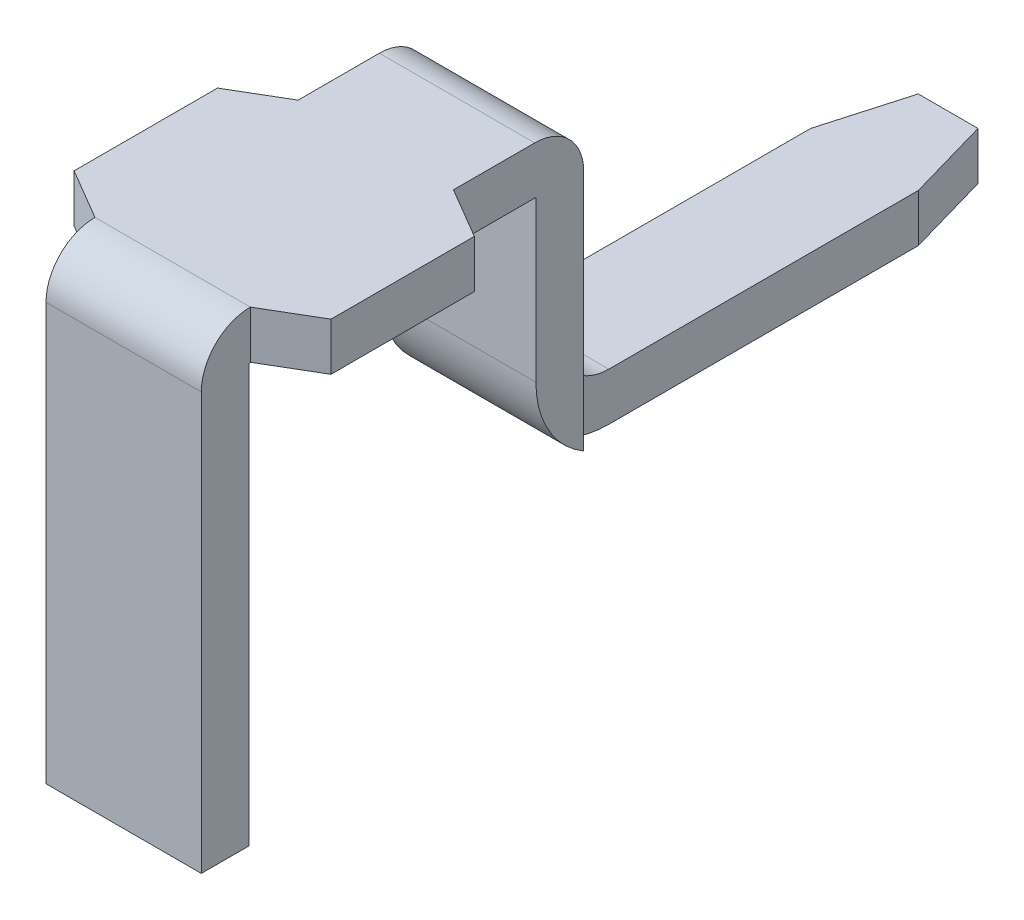
ISO-10303-21;
HEADER;
FILE_DESCRIPTION(('STEP AP214'),'2;1');
FILE_NAME('part.step','',(''),(''),'','','');
FILE_SCHEMA(('AUTOMOTIVE_DESIGN { 1 0 10303 214 1 1 1 1 }'));
ENDSEC;
DATA;
#1=APPLICATION_CONTEXT('core data for automotive mechanical design processes');
#2=APPLICATION_PROTOCOL_DEFINITION('international standard','automotive_design',2000,#1);
#3=PRODUCT_CONTEXT('',#1,'mechanical');
#4=PRODUCT('Part','Part','',(#3));
#5=PRODUCT_RELATED_PRODUCT_CATEGORY('part','',(#4));
#6=PRODUCT_DEFINITION_FORMATION('','',#4);
#7=PRODUCT_DEFINITION_CONTEXT('part definition',#1,'design');
#8=PRODUCT_DEFINITION('design','',#6,#7);
#9=PRODUCT_DEFINITION_SHAPE('','',#8);
#10=(LENGTH_UNIT() NAMED_UNIT(*) SI_UNIT(.MILLI.,.METRE.));
#11=(NAMED_UNIT(*) PLANE_ANGLE_UNIT() SI_UNIT($,.RADIAN.));
#12=(NAMED_UNIT(*) SI_UNIT($,.STERADIAN.) SOLID_ANGLE_UNIT());
#13=UNCERTAINTY_MEASURE_WITH_UNIT(LENGTH_MEASURE(1.E-05),#10,'distance_accuracy_value','');
#14=(GEOMETRIC_REPRESENTATION_CONTEXT(3) GLOBAL_UNCERTAINTY_ASSIGNED_CONTEXT((#13)) GLOBAL_UNIT_ASSIGNED_CONTEXT((#10,
#11,#12)) REPRESENTATION_CONTEXT('',''));
#15=CARTESIAN_POINT('',(0.,0.,0.));
#16=DIRECTION('',(0.,0.,1.));
#17=DIRECTION('',(1.,0.,0.));
#18=AXIS2_PLACEMENT_3D('',#15,#16,#17);
#19=CARTESIAN_POINT('',(3.615,0.2,-5.95));
#20=DIRECTION('',(0.,0.,1.));
#21=DIRECTION('',(1.,0.,0.));
#22=AXIS2_PLACEMENT_3D('',#19,#20,#21);
#23=PLANE('',#22);
#24=DIRECTION('',(0.,1.,0.));
#25=VECTOR('',#24,1.);
#26=CARTESIAN_POINT('',(2.79000000000029,-5.862338278469,-5.95000000000008));
#27=LINE('',#26,#25);
#28=CARTESIAN_POINT('',(2.79000000000009,0.2,-5.95000000000003));
#29=VERTEX_POINT('',#28);
#30=CARTESIAN_POINT('',(2.79000000000009,-0.2,-5.95000000000003));
#31=VERTEX_POINT('',#30);
#32=EDGE_CURVE('E200',#29,#31,#27,.F.);
#33=ORIENTED_EDGE('',*,*,#32,.T.);
#34=DIRECTION('',(1.,0.,0.));
#35=VECTOR('',#34,1.);
#36=CARTESIAN_POINT('',(3.615,-0.2,-5.95));
#37=LINE('',#36,#35);
#38=CARTESIAN_POINT('',(2.29,-0.2,-5.95));
#39=VERTEX_POINT('',#38);
#40=EDGE_CURVE('E216',#39,#31,#37,.T.);
#41=ORIENTED_EDGE('',*,*,#40,.F.);
#42=DIRECTION('',(0.,1.,0.));
#43=VECTOR('',#42,1.);
#44=CARTESIAN_POINT('',(2.29,0.2,-5.95));
#45=LINE('',#44,#43);
#46=CARTESIAN_POINT('',(2.29,0.199999999999999,-5.95));
#47=VERTEX_POINT('',#46);
#48=EDGE_CURVE('E209',#39,#47,#45,.T.);
#49=ORIENTED_EDGE('',*,*,#48,.T.);
#50=DIRECTION('',(1.,0.,0.));
#51=VECTOR('',#50,1.);
#52=CARTESIAN_POINT('',(3.615,0.2,-5.95));
#53=LINE('',#52,#51);
#54=EDGE_CURVE('E287',#47,#29,#53,.T.);
#55=ORIENTED_EDGE('',*,*,#54,.T.);
#56=EDGE_LOOP('',(#33,#41,#49,#55));
#57=FACE_BOUND('',#56,.T.);
#58=ADVANCED_FACE('F17',(#57),#23,.F.);
#59=CARTESIAN_POINT('',(2.99,-5.862338278469,-5.25));
#60=DIRECTION('',(-0.961523947640936,0.,0.274721127896982));
#61=DIRECTION('',(0.274721127896982,0.,0.961523947640936));
#62=AXIS2_PLACEMENT_3D('',#59,#60,#61);
#63=PLANE('',#62);
#64=ORIENTED_EDGE('',*,*,#32,.F.);
#65=DIRECTION('',(0.274721127897379,0.,0.961523947640823));
#66=VECTOR('',#65,1.);
#67=CARTESIAN_POINT('',(2.79,0.199999999999999,-5.95));
#68=LINE('',#67,#66);
#69=CARTESIAN_POINT('',(2.99,0.199999999999999,-5.25));
#70=VERTEX_POINT('',#69);
#71=EDGE_CURVE('E281',#29,#70,#68,.T.);
#72=ORIENTED_EDGE('',*,*,#71,.T.);
#73=DIRECTION('',(0.,1.,0.));
#74=VECTOR('',#73,1.);
#75=CARTESIAN_POINT('',(2.99,-5.862338278469,-5.25));
#76=LINE('',#75,#74);
#77=CARTESIAN_POINT('',(2.99,-0.2,-5.25));
#78=VERTEX_POINT('',#77);
#79=EDGE_CURVE('E266',#70,#78,#76,.F.);
#80=ORIENTED_EDGE('',*,*,#79,.T.);
#81=DIRECTION('',(0.274721127897379,0.,0.961523947640823));
#82=VECTOR('',#81,1.);
#83=CARTESIAN_POINT('',(2.79,-0.200000000000001,-5.95));
#84=LINE('',#83,#82);
#85=EDGE_CURVE('E214',#31,#78,#84,.T.);
#86=ORIENTED_EDGE('',*,*,#85,.F.);
#87=EDGE_LOOP('',(#64,#72,#80,#86));
#88=FACE_BOUND('',#87,.T.);
#89=ADVANCED_FACE('F309',(#88),#63,.F.);
#90=CARTESIAN_POINT('',(2.99,-5.862338278469,-5.95));
#91=DIRECTION('',(-1.,0.,0.));
#92=DIRECTION('',(0.,0.,1.));
#93=AXIS2_PLACEMENT_3D('',#90,#91,#92);
#94=PLANE('',#93);
#95=ORIENTED_EDGE('',*,*,#79,.F.);
#96=DIRECTION('',(0.,0.,1.));
#97=VECTOR('',#96,1.);
#98=CARTESIAN_POINT('',(2.99,0.2,-5.95));
#99=LINE('',#98,#97);
#100=CARTESIAN_POINT('',(2.99,0.199999999999998,-2.66));
#101=VERTEX_POINT('',#100);
#102=EDGE_CURVE('E278',#70,#101,#99,.T.);
#103=ORIENTED_EDGE('',*,*,#102,.T.);
#104=CARTESIAN_POINT('',(2.99,0.61,-2.66));
#105=DIRECTION('',(-1.,0.,0.));
#106=DIRECTION('',(0.,0.,1.));
#107=AXIS2_PLACEMENT_3D('',#104,#105,#106);
#108=CIRCLE('',#107,0.41);
#109=CARTESIAN_POINT('',(2.99,0.61,-2.25));
#110=VERTEX_POINT('',#109);
#111=EDGE_CURVE('E265',#110,#101,#108,.F.);
#112=ORIENTED_EDGE('',*,*,#111,.F.);
#113=DIRECTION('',(0.,1.,0.));
#114=VECTOR('',#113,1.);
#115=CARTESIAN_POINT('',(2.99,-5.862338278469,-2.25));
#116=LINE('',#115,#114);
#117=CARTESIAN_POINT('',(2.99,-0.0885699678629199,-2.25));
#118=VERTEX_POINT('',#117);
#119=EDGE_CURVE('E196',#118,#110,#116,.T.);
#120=ORIENTED_EDGE('',*,*,#119,.F.);
#121=CARTESIAN_POINT('',(2.99,0.61,-2.66));
#122=DIRECTION('',(-1.,0.,0.));
#123=DIRECTION('',(0.,0.,1.));
#124=AXIS2_PLACEMENT_3D('',#121,#122,#123);
#125=CIRCLE('',#124,0.81);
#126=CARTESIAN_POINT('',(2.99,-0.200000000000002,-2.66));
#127=VERTEX_POINT('',#126);
#128=EDGE_CURVE('E20',#127,#118,#125,.T.);
#129=ORIENTED_EDGE('',*,*,#128,.F.);
#130=DIRECTION('',(0.,0.,1.));
#131=VECTOR('',#130,1.);
#132=CARTESIAN_POINT('',(2.99,-0.2,-5.95));
#133=LINE('',#132,#131);
#134=EDGE_CURVE('E193',#78,#127,#133,.T.);
#135=ORIENTED_EDGE('',*,*,#134,.F.);
#136=EDGE_LOOP('',(#95,#103,#112,#120,#129,#135));
#137=FACE_BOUND('',#136,.T.);
#138=ADVANCED_FACE('F191',(#137),#94,.F.);
#139=CARTESIAN_POINT('',(3.615,-0.2,-5.95));
#140=DIRECTION('',(0.,-1.,0.));
#141=DIRECTION('',(1.,0.,0.));
#142=AXIS2_PLACEMENT_3D('',#139,#140,#141);
#143=PLANE('',#142);
#144=DIRECTION('',(0.,0.,-1.));
#145=VECTOR('',#144,1.);
#146=CARTESIAN_POINT('',(2.09,-0.2,-2.25));
#147=LINE('',#146,#145);
#148=CARTESIAN_POINT('',(2.09,-0.2,-2.66));
#149=VERTEX_POINT('',#148);
#150=CARTESIAN_POINT('',(2.0900000000001,-0.2,-5.24999999999997));
#151=VERTEX_POINT('',#150);
#152=EDGE_CURVE('E260',#149,#151,#147,.T.);
#153=ORIENTED_EDGE('',*,*,#152,.T.);
#154=DIRECTION('',(0.274721127896982,0.,-0.961523947640936));
#155=VECTOR('',#154,1.);
#156=CARTESIAN_POINT('',(2.29,-0.2,-5.95));
#157=LINE('',#156,#155);
#158=EDGE_CURVE('E298',#151,#39,#157,.T.);
#159=ORIENTED_EDGE('',*,*,#158,.T.);
#160=ORIENTED_EDGE('',*,*,#40,.T.);
#161=ORIENTED_EDGE('',*,*,#85,.T.);
#162=ORIENTED_EDGE('',*,*,#134,.T.);
#163=DIRECTION('',(1.,0.,0.));
#164=VECTOR('',#163,1.);
#165=CARTESIAN_POINT('',(3.615,-0.200000000000002,-2.66));
#166=LINE('',#165,#164);
#167=EDGE_CURVE('E202',#127,#149,#166,.F.);
#168=ORIENTED_EDGE('',*,*,#167,.T.);
#169=EDGE_LOOP('',(#153,#159,#160,#161,#162,#168));
#170=FACE_BOUND('',#169,.T.);
#171=ADVANCED_FACE('F211',(#170),#143,.T.);
#172=CARTESIAN_POINT('',(2.29,0.2,-5.95));
#173=DIRECTION('',(0.961523947640936,0.,0.274721127896982));
#174=DIRECTION('',(0.274721127896982,0.,-0.961523947640936));
#175=AXIS2_PLACEMENT_3D('',#172,#173,#174);
#176=PLANE('',#175);
#177=DIRECTION('',(0.,1.,0.));
#178=VECTOR('',#177,1.);
#179=CARTESIAN_POINT('',(2.09,-5.862338278469,-5.25));
#180=LINE('',#179,#178);
#181=CARTESIAN_POINT('',(2.09,0.199999999999999,-5.25));
#182=VERTEX_POINT('',#181);
#183=EDGE_CURVE('E328',#151,#182,#180,.T.);
#184=ORIENTED_EDGE('',*,*,#183,.T.);
#185=DIRECTION('',(0.274721127897378,0.,-0.961523947640823));
#186=VECTOR('',#185,1.);
#187=CARTESIAN_POINT('',(2.09,0.199999999999999,-5.25));
#188=LINE('',#187,#186);
#189=EDGE_CURVE('E294',#182,#47,#188,.T.);
#190=ORIENTED_EDGE('',*,*,#189,.T.);
#191=ORIENTED_EDGE('',*,*,#48,.F.);
#192=ORIENTED_EDGE('',*,*,#158,.F.);
#193=EDGE_LOOP('',(#184,#190,#191,#192));
#194=FACE_BOUND('',#193,.T.);
#195=ADVANCED_FACE('F756',(#194),#176,.F.);
#196=CARTESIAN_POINT('',(3.615,0.2,-5.95));
#197=DIRECTION('',(0.,-1.,0.));
#198=DIRECTION('',(1.,0.,0.));
#199=AXIS2_PLACEMENT_3D('',#196,#197,#198);
#200=PLANE('',#199);
#201=ORIENTED_EDGE('',*,*,#71,.F.);
#202=ORIENTED_EDGE('',*,*,#54,.F.);
#203=ORIENTED_EDGE('',*,*,#189,.F.);
#204=DIRECTION('',(0.,0.,-1.));
#205=VECTOR('',#204,1.);
#206=CARTESIAN_POINT('',(2.09,0.2,-2.25));
#207=LINE('',#206,#205);
#208=CARTESIAN_POINT('',(2.09,0.199999999999999,-2.66));
#209=VERTEX_POINT('',#208);
#210=EDGE_CURVE('E258',#182,#209,#207,.F.);
#211=ORIENTED_EDGE('',*,*,#210,.T.);
#212=DIRECTION('',(1.,0.,0.));
#213=VECTOR('',#212,1.);
#214=CARTESIAN_POINT('',(3.615,0.199999999999998,-2.66));
#215=LINE('',#214,#213);
#216=EDGE_CURVE('E315',#101,#209,#215,.F.);
#217=ORIENTED_EDGE('',*,*,#216,.F.);
#218=ORIENTED_EDGE('',*,*,#102,.F.);
#219=EDGE_LOOP('',(#201,#202,#203,#211,#217,#218));
#220=FACE_BOUND('',#219,.T.);
#221=ADVANCED_FACE('F313',(#220),#200,.F.);
#222=CARTESIAN_POINT('',(1.89,-5.862338278469,-2.25));
#223=DIRECTION('',(1.,0.,0.));
#224=DIRECTION('',(0.,0.,-1.));
#225=AXIS2_PLACEMENT_3D('',#222,#223,#224);
#226=PLANE('',#225);
#227=DIRECTION('',(0.,-1.,0.));
#228=VECTOR('',#227,1.);
#229=CARTESIAN_POINT('',(1.89,0.61,-1.85));
#230=LINE('',#229,#228);
#231=CARTESIAN_POINT('',(1.89,1.94,-1.85));
#232=VERTEX_POINT('',#231);
#233=CARTESIAN_POINT('',(1.89,0.609999999999999,-1.85));
#234=VERTEX_POINT('',#233);
#235=EDGE_CURVE('E251',#232,#234,#230,.T.);
#236=ORIENTED_EDGE('',*,*,#235,.F.);
#237=CARTESIAN_POINT('',(1.89,1.94,-1.84));
#238=DIRECTION('',(-1.,0.,0.));
#239=DIRECTION('',(0.,0.,1.));
#240=AXIS2_PLACEMENT_3D('',#237,#238,#239);
#241=CIRCLE('',#240,0.01);
#242=CARTESIAN_POINT('',(1.89,1.95,-1.84));
#243=VERTEX_POINT('',#242);
#244=EDGE_CURVE('E263',#243,#232,#241,.T.);
#245=ORIENTED_EDGE('',*,*,#244,.F.);
#246=DIRECTION('',(0.,0.,-1.));
#247=VECTOR('',#246,1.);
#248=CARTESIAN_POINT('',(1.89,1.95,-2.25));
#249=LINE('',#248,#247);
#250=CARTESIAN_POINT('',(1.88999999999999,1.95,-1.16));
#251=VERTEX_POINT('',#250);
#252=EDGE_CURVE('E264',#251,#243,#249,.T.);
#253=ORIENTED_EDGE('',*,*,#252,.F.);
#254=DIRECTION('',(0.,1.,0.));
#255=VECTOR('',#254,1.);
#256=CARTESIAN_POINT('',(1.89,-5.862338278469,-1.16));
#257=LINE('',#256,#255);
#258=CARTESIAN_POINT('',(1.89000000000003,2.35,-1.15999999999994));
#259=VERTEX_POINT('',#258);
#260=EDGE_CURVE('E340',#259,#251,#257,.F.);
#261=ORIENTED_EDGE('',*,*,#260,.F.);
#262=DIRECTION('',(0.,0.,-1.));
#263=VECTOR('',#262,1.);
#264=CARTESIAN_POINT('',(1.88999999999999,2.35,-2.25));
#265=LINE('',#264,#263);
#266=CARTESIAN_POINT('',(1.89,2.35,-1.84));
#267=VERTEX_POINT('',#266);
#268=EDGE_CURVE('E280',#267,#259,#265,.F.);
#269=ORIENTED_EDGE('',*,*,#268,.F.);
#270=CARTESIAN_POINT('',(1.89,1.94,-1.84));
#271=DIRECTION('',(-1.,0.,0.));
#272=DIRECTION('',(0.,0.,1.));
#273=AXIS2_PLACEMENT_3D('',#270,#271,#272);
#274=CIRCLE('',#273,0.41);
#275=CARTESIAN_POINT('',(1.89,1.94,-2.25));
#276=VERTEX_POINT('',#275);
#277=EDGE_CURVE('E252',#276,#267,#274,.F.);
#278=ORIENTED_EDGE('',*,*,#277,.F.);
#279=DIRECTION('',(0.,-1.,0.));
#280=VECTOR('',#279,1.);
#281=CARTESIAN_POINT('',(1.89,0.61,-2.25));
#282=LINE('',#281,#280);
#283=CARTESIAN_POINT('',(1.89,-0.0885699678629191,-2.25));
#284=VERTEX_POINT('',#283);
#285=EDGE_CURVE('E323',#276,#284,#282,.T.);
#286=ORIENTED_EDGE('',*,*,#285,.T.);
#287=CARTESIAN_POINT('',(1.89,0.609999999999999,-2.66));
#288=DIRECTION('',(-1.,0.,0.));
#289=DIRECTION('',(0.,0.,1.));
#290=AXIS2_PLACEMENT_3D('',#287,#288,#289);
#291=CIRCLE('',#290,0.81);
#292=EDGE_CURVE('E261',#234,#284,#291,.F.);
#293=ORIENTED_EDGE('',*,*,#292,.F.);
#294=EDGE_LOOP('',(#236,#245,#253,#261,#269,#278,#286,#293));
#295=FACE_BOUND('',#294,.T.);
#296=ADVANCED_FACE('F739',(#295),#226,.F.);
#297=CARTESIAN_POINT('',(2.09,-5.862338278469,-2.25));
#298=DIRECTION('',(1.,0.,0.));
#299=DIRECTION('',(0.,0.,-1.));
#300=AXIS2_PLACEMENT_3D('',#297,#298,#299);
#301=PLANE('',#300);
#302=ORIENTED_EDGE('',*,*,#183,.F.);
#303=ORIENTED_EDGE('',*,*,#152,.F.);
#304=CARTESIAN_POINT('',(2.09,0.609999999999999,-2.66));
#305=DIRECTION('',(-1.,0.,0.));
#306=DIRECTION('',(0.,0.,1.));
#307=AXIS2_PLACEMENT_3D('',#304,#305,#306);
#308=CIRCLE('',#307,0.81);
#309=CARTESIAN_POINT('',(2.09,-0.088569967862919,-2.25));
#310=VERTEX_POINT('',#309);
#311=EDGE_CURVE('E206',#310,#149,#308,.F.);
#312=ORIENTED_EDGE('',*,*,#311,.F.);
#313=DIRECTION('',(0.,-1.,0.));
#314=VECTOR('',#313,1.);
#315=CARTESIAN_POINT('',(2.09,0.61,-2.25));
#316=LINE('',#315,#314);
#317=CARTESIAN_POINT('',(2.09,0.609999999999999,-2.25));
#318=VERTEX_POINT('',#317);
#319=EDGE_CURVE('E356',#310,#318,#316,.F.);
#320=ORIENTED_EDGE('',*,*,#319,.T.);
#321=CARTESIAN_POINT('',(2.09,0.609999999999999,-2.66));
#322=DIRECTION('',(-1.,0.,0.));
#323=DIRECTION('',(0.,0.,1.));
#324=AXIS2_PLACEMENT_3D('',#321,#322,#323);
#325=CIRCLE('',#324,0.41);
#326=EDGE_CURVE('E255',#318,#209,#325,.F.);
#327=ORIENTED_EDGE('',*,*,#326,.T.);
#328=ORIENTED_EDGE('',*,*,#210,.F.);
#329=EDGE_LOOP('',(#302,#303,#312,#320,#327,#328));
#330=FACE_BOUND('',#329,.T.);
#331=ADVANCED_FACE('F731',(#330),#301,.F.);
#332=CARTESIAN_POINT('',(3.615,0.61,-2.66));
#333=DIRECTION('',(-1.,0.,0.));
#334=DIRECTION('',(0.,0.,1.));
#335=AXIS2_PLACEMENT_3D('',#332,#333,#334);
#336=CYLINDRICAL_SURFACE('',#335,0.41);
#337=ORIENTED_EDGE('',*,*,#326,.F.);
#338=DIRECTION('',(1.,0.,0.));
#339=VECTOR('',#338,1.);
#340=CARTESIAN_POINT('',(3.615,0.61,-2.25));
#341=LINE('',#340,#339);
#342=EDGE_CURVE('E353',#318,#110,#341,.T.);
#343=ORIENTED_EDGE('',*,*,#342,.T.);
#344=ORIENTED_EDGE('',*,*,#111,.T.);
#345=ORIENTED_EDGE('',*,*,#216,.T.);
#346=EDGE_LOOP('',(#337,#343,#344,#345));
#347=FACE_BOUND('',#346,.T.);
#348=ADVANCED_FACE('F722',(#347),#336,.F.);
#349=CARTESIAN_POINT('',(3.615,1.94,-1.84));
#350=DIRECTION('',(-1.,0.,0.));
#351=DIRECTION('',(0.,0.,1.));
#352=AXIS2_PLACEMENT_3D('',#349,#350,#351);
#353=CYLINDRICAL_SURFACE('',#352,0.41);
#354=DIRECTION('',(1.,0.,0.));
#355=VECTOR('',#354,1.);
#356=CARTESIAN_POINT('',(3.615,2.35,-1.84));
#357=LINE('',#356,#355);
#358=CARTESIAN_POINT('',(3.19,2.35,-1.84));
#359=VERTEX_POINT('',#358);
#360=EDGE_CURVE('E381',#267,#359,#357,.T.);
#361=ORIENTED_EDGE('',*,*,#360,.T.);
#362=CARTESIAN_POINT('',(3.19,1.94,-1.84));
#363=DIRECTION('',(-1.,0.,0.));
#364=DIRECTION('',(0.,0.,1.));
#365=AXIS2_PLACEMENT_3D('',#362,#363,#364);
#366=CIRCLE('',#365,0.41);
#367=CARTESIAN_POINT('',(3.19,1.94,-2.25));
#368=VERTEX_POINT('',#367);
#369=EDGE_CURVE('E249',#359,#368,#366,.T.);
#370=ORIENTED_EDGE('',*,*,#369,.T.);
#371=DIRECTION('',(1.,0.,0.));
#372=VECTOR('',#371,1.);
#373=CARTESIAN_POINT('',(3.615,1.94,-2.25));
#374=LINE('',#373,#372);
#375=EDGE_CURVE('E378',#368,#276,#374,.F.);
#376=ORIENTED_EDGE('',*,*,#375,.T.);
#377=ORIENTED_EDGE('',*,*,#277,.T.);
#378=EDGE_LOOP('',(#361,#370,#376,#377));
#379=FACE_BOUND('',#378,.T.);
#380=ADVANCED_FACE('F713',(#379),#353,.T.);
#381=CARTESIAN_POINT('',(3.615,0.61,-1.85));
#382=DIRECTION('',(0.,0.,1.));
#383=DIRECTION('',(0.,-1.,0.));
#384=AXIS2_PLACEMENT_3D('',#381,#382,#383);
#385=PLANE('',#384);
#386=DIRECTION('',(0.,1.,0.));
#387=VECTOR('',#386,1.);
#388=CARTESIAN_POINT('',(3.19,-5.862338278469,-1.85));
#389=LINE('',#388,#387);
#390=CARTESIAN_POINT('',(3.19,0.61,-1.85));
#391=VERTEX_POINT('',#390);
#392=CARTESIAN_POINT('',(3.19,1.94,-1.85));
#393=VERTEX_POINT('',#392);
#394=EDGE_CURVE('E248',#391,#393,#389,.T.);
#395=ORIENTED_EDGE('',*,*,#394,.T.);
#396=DIRECTION('',(-1.,0.,0.));
#397=VECTOR('',#396,1.);
#398=CARTESIAN_POINT('',(3.615,1.94,-1.85));
#399=LINE('',#398,#397);
#400=EDGE_CURVE('E370',#393,#232,#399,.T.);
#401=ORIENTED_EDGE('',*,*,#400,.T.);
#402=ORIENTED_EDGE('',*,*,#235,.T.);
#403=DIRECTION('',(-1.,0.,0.));
#404=VECTOR('',#403,1.);
#405=CARTESIAN_POINT('',(3.615,0.61,-1.85));
#406=LINE('',#405,#404);
#407=EDGE_CURVE('E385',#391,#234,#406,.T.);
#408=ORIENTED_EDGE('',*,*,#407,.F.);
#409=EDGE_LOOP('',(#395,#401,#402,#408));
#410=FACE_BOUND('',#409,.T.);
#411=ADVANCED_FACE('F705',(#410),#385,.T.);
#412=CARTESIAN_POINT('',(3.615,0.61,-2.25));
#413=DIRECTION('',(0.,0.,1.));
#414=DIRECTION('',(0.,-1.,0.));
#415=AXIS2_PLACEMENT_3D('',#412,#413,#414);
#416=PLANE('',#415);
#417=ORIENTED_EDGE('',*,*,#319,.F.);
#418=DIRECTION('',(-1.,0.,0.));
#419=VECTOR('',#418,1.);
#420=CARTESIAN_POINT('',(3.615,-0.0885699678629162,-2.24999999999999));
#421=LINE('',#420,#419);
#422=EDGE_CURVE('E355',#284,#310,#421,.F.);
#423=ORIENTED_EDGE('',*,*,#422,.F.);
#424=ORIENTED_EDGE('',*,*,#285,.F.);
#425=ORIENTED_EDGE('',*,*,#375,.F.);
#426=DIRECTION('',(0.,1.,0.));
#427=VECTOR('',#426,1.);
#428=CARTESIAN_POINT('',(3.19,-5.862338278469,-2.25));
#429=LINE('',#428,#427);
#430=CARTESIAN_POINT('',(3.19,-0.0885699678629196,-2.25));
#431=VERTEX_POINT('',#430);
#432=EDGE_CURVE('E244',#368,#431,#429,.F.);
#433=ORIENTED_EDGE('',*,*,#432,.T.);
#434=DIRECTION('',(-1.,0.,0.));
#435=VECTOR('',#434,1.);
#436=CARTESIAN_POINT('',(3.615,-0.0885699678629194,-2.25));
#437=LINE('',#436,#435);
#438=EDGE_CURVE('E358',#118,#431,#437,.F.);
#439=ORIENTED_EDGE('',*,*,#438,.F.);
#440=ORIENTED_EDGE('',*,*,#119,.T.);
#441=ORIENTED_EDGE('',*,*,#342,.F.);
#442=EDGE_LOOP('',(#417,#423,#424,#425,#433,#439,#440,#441));
#443=FACE_BOUND('',#442,.T.);
#444=ADVANCED_FACE('F697',(#443),#416,.F.);
#445=CARTESIAN_POINT('',(3.615,0.61,-2.66));
#446=DIRECTION('',(-1.,0.,0.));
#447=DIRECTION('',(0.,0.,1.));
#448=AXIS2_PLACEMENT_3D('',#445,#446,#447);
#449=CYLINDRICAL_SURFACE('',#448,0.81);
#450=CARTESIAN_POINT('',(3.19,0.61,-2.66));
#451=DIRECTION('',(-1.,0.,0.));
#452=DIRECTION('',(0.,0.,1.));
#453=AXIS2_PLACEMENT_3D('',#450,#451,#452);
#454=CIRCLE('',#453,0.81);
#455=EDGE_CURVE('E241',#431,#391,#454,.T.);
#456=ORIENTED_EDGE('',*,*,#455,.T.);
#457=ORIENTED_EDGE('',*,*,#407,.T.);
#458=ORIENTED_EDGE('',*,*,#292,.T.);
#459=ORIENTED_EDGE('',*,*,#422,.T.);
#460=ORIENTED_EDGE('',*,*,#311,.T.);
#461=ORIENTED_EDGE('',*,*,#167,.F.);
#462=ORIENTED_EDGE('',*,*,#128,.T.);
#463=ORIENTED_EDGE('',*,*,#438,.T.);
#464=EDGE_LOOP('',(#456,#457,#458,#459,#460,#461,#462,#463));
#465=FACE_BOUND('',#464,.T.);
#466=ADVANCED_FACE('F204',(#465),#449,.T.);
#467=CARTESIAN_POINT('',(3.615,2.35,-1.84));
#468=DIRECTION('',(0.,-1.,0.));
#469=DIRECTION('',(1.,0.,0.));
#470=AXIS2_PLACEMENT_3D('',#467,#468,#469);
#471=PLANE('',#470);
#472=DIRECTION('',(-0.861934215157769,0.,-0.507020126563394));
#473=VECTOR('',#472,1.);
#474=CARTESIAN_POINT('',(1.89,2.35,0.54));
#475=LINE('',#474,#473);
#476=CARTESIAN_POINT('',(1.89,2.35,0.54));
#477=VERTEX_POINT('',#476);
#478=CARTESIAN_POINT('',(1.46499999999996,2.35,0.290000000000132));
#479=VERTEX_POINT('',#478);
#480=EDGE_CURVE('E393',#477,#479,#475,.T.);
#481=ORIENTED_EDGE('',*,*,#480,.F.);
#482=DIRECTION('',(-1.,0.,0.));
#483=VECTOR('',#482,1.);
#484=CARTESIAN_POINT('',(3.615,2.35,0.54));
#485=LINE('',#484,#483);
#486=CARTESIAN_POINT('',(3.19,2.35,0.54));
#487=VERTEX_POINT('',#486);
#488=EDGE_CURVE('E240',#487,#477,#485,.T.);
#489=ORIENTED_EDGE('',*,*,#488,.F.);
#490=DIRECTION('',(-0.861934215157769,0.,0.507020126563394));
#491=VECTOR('',#490,1.);
#492=CARTESIAN_POINT('',(3.615,2.35,0.29));
#493=LINE('',#492,#491);
#494=CARTESIAN_POINT('',(3.615,2.35,0.29));
#495=VERTEX_POINT('',#494);
#496=EDGE_CURVE('E384',#495,#487,#493,.T.);
#497=ORIENTED_EDGE('',*,*,#496,.F.);
#498=DIRECTION('',(0.,0.,-1.));
#499=VECTOR('',#498,1.);
#500=CARTESIAN_POINT('',(3.615,2.35,0.95));
#501=LINE('',#500,#499);
#502=CARTESIAN_POINT('',(3.61500000000004,2.35,-0.910000000000063));
#503=VERTEX_POINT('',#502);
#504=EDGE_CURVE('E418',#503,#495,#501,.F.);
#505=ORIENTED_EDGE('',*,*,#504,.F.);
#506=DIRECTION('',(0.861934215158001,0.,0.507020126563001));
#507=VECTOR('',#506,1.);
#508=CARTESIAN_POINT('',(3.19,2.35,-1.16));
#509=LINE('',#508,#507);
#510=CARTESIAN_POINT('',(3.19,2.35,-1.16));
#511=VERTEX_POINT('',#510);
#512=EDGE_CURVE('E243',#503,#511,#509,.F.);
#513=ORIENTED_EDGE('',*,*,#512,.T.);
#514=DIRECTION('',(0.,0.,1.));
#515=VECTOR('',#514,1.);
#516=CARTESIAN_POINT('',(3.19,2.35,-2.25));
#517=LINE('',#516,#515);
#518=EDGE_CURVE('E247',#511,#359,#517,.F.);
#519=ORIENTED_EDGE('',*,*,#518,.T.);
#520=ORIENTED_EDGE('',*,*,#360,.F.);
#521=ORIENTED_EDGE('',*,*,#268,.T.);
#522=DIRECTION('',(0.861934215158001,0.,-0.507020126563001));
#523=VECTOR('',#522,1.);
#524=CARTESIAN_POINT('',(1.465,2.35,-0.910000000000001));
#525=LINE('',#524,#523);
#526=CARTESIAN_POINT('',(1.46499999999999,2.35,-0.91));
#527=VERTEX_POINT('',#526);
#528=EDGE_CURVE('E371',#259,#527,#525,.F.);
#529=ORIENTED_EDGE('',*,*,#528,.T.);
#530=DIRECTION('',(0.,0.,-1.));
#531=VECTOR('',#530,1.);
#532=CARTESIAN_POINT('',(1.465,2.35,-5.95));
#533=LINE('',#532,#531);
#534=EDGE_CURVE('E375',#527,#479,#533,.F.);
#535=ORIENTED_EDGE('',*,*,#534,.T.);
#536=EDGE_LOOP('',(#481,#489,#497,#505,#513,#519,#520,#521,#529,#535));
#537=FACE_BOUND('',#536,.T.);
#538=ADVANCED_FACE('F539',(#537),#471,.F.);
#539=CARTESIAN_POINT('',(1.465,0.2,-5.95));
#540=DIRECTION('',(1.,0.,0.));
#541=DIRECTION('',(0.,0.,-1.));
#542=AXIS2_PLACEMENT_3D('',#539,#540,#541);
#543=PLANE('',#542);
#544=ORIENTED_EDGE('',*,*,#534,.F.);
#545=DIRECTION('',(0.,1.,0.));
#546=VECTOR('',#545,1.);
#547=CARTESIAN_POINT('',(1.465,-5.862338278469,-0.91));
#548=LINE('',#547,#546);
#549=CARTESIAN_POINT('',(1.465,1.95,-0.91));
#550=VERTEX_POINT('',#549);
#551=EDGE_CURVE('E368',#527,#550,#548,.F.);
#552=ORIENTED_EDGE('',*,*,#551,.T.);
#553=DIRECTION('',(0.,0.,1.));
#554=VECTOR('',#553,1.);
#555=CARTESIAN_POINT('',(1.465,1.95,-1.84));
#556=LINE('',#555,#554);
#557=CARTESIAN_POINT('',(1.46499999999996,1.95,0.290000000000066));
#558=VERTEX_POINT('',#557);
#559=EDGE_CURVE('E338',#558,#550,#556,.F.);
#560=ORIENTED_EDGE('',*,*,#559,.F.);
#561=DIRECTION('',(0.,1.,0.));
#562=VECTOR('',#561,1.);
#563=CARTESIAN_POINT('',(1.46499999999989,-5.862338278469,0.290000000000194));
#564=LINE('',#563,#562);
#565=EDGE_CURVE('E415',#558,#479,#564,.T.);
#566=ORIENTED_EDGE('',*,*,#565,.T.);
#567=EDGE_LOOP('',(#544,#552,#560,#566));
#568=FACE_BOUND('',#567,.T.);
#569=ADVANCED_FACE('F545',(#568),#543,.F.);
#570=CARTESIAN_POINT('',(1.465,-5.862338278469,-0.91));
#571=DIRECTION('',(0.507020126563001,0.,0.861934215158001));
#572=DIRECTION('',(0.861934215158001,0.,-0.507020126563001));
#573=AXIS2_PLACEMENT_3D('',#570,#571,#572);
#574=PLANE('',#573);
#575=ORIENTED_EDGE('',*,*,#551,.F.);
#576=ORIENTED_EDGE('',*,*,#528,.F.);
#577=ORIENTED_EDGE('',*,*,#260,.T.);
#578=DIRECTION('',(0.861934215157769,0.,-0.507020126563394));
#579=VECTOR('',#578,1.);
#580=CARTESIAN_POINT('',(1.465,1.95,-0.91));
#581=LINE('',#580,#579);
#582=EDGE_CURVE('E334',#550,#251,#581,.T.);
#583=ORIENTED_EDGE('',*,*,#582,.F.);
#584=EDGE_LOOP('',(#575,#576,#577,#583));
#585=FACE_BOUND('',#584,.T.);
#586=ADVANCED_FACE('F667',(#585),#574,.F.);
#587=CARTESIAN_POINT('',(3.615,1.94,-1.84));
#588=DIRECTION('',(-1.,0.,0.));
#589=DIRECTION('',(0.,0.,1.));
#590=AXIS2_PLACEMENT_3D('',#587,#588,#589);
#591=CYLINDRICAL_SURFACE('',#590,0.01);
#592=ORIENTED_EDGE('',*,*,#400,.F.);
#593=CARTESIAN_POINT('',(3.19,1.94,-1.84));
#594=DIRECTION('',(-1.,0.,0.));
#595=DIRECTION('',(0.,0.,1.));
#596=AXIS2_PLACEMENT_3D('',#593,#594,#595);
#597=CIRCLE('',#596,0.01);
#598=CARTESIAN_POINT('',(3.19,1.95,-1.84));
#599=VERTEX_POINT('',#598);
#600=EDGE_CURVE('E245',#393,#599,#597,.F.);
#601=ORIENTED_EDGE('',*,*,#600,.T.);
#602=DIRECTION('',(1.,0.,0.));
#603=VECTOR('',#602,1.);
#604=CARTESIAN_POINT('',(3.615,1.95,-1.84));
#605=LINE('',#604,#603);
#606=EDGE_CURVE('E337',#243,#599,#605,.T.);
#607=ORIENTED_EDGE('',*,*,#606,.F.);
#608=ORIENTED_EDGE('',*,*,#244,.T.);
#609=EDGE_LOOP('',(#592,#601,#607,#608));
#610=FACE_BOUND('',#609,.T.);
#611=ADVANCED_FACE('F658',(#610),#591,.F.);
#612=CARTESIAN_POINT('',(3.19,-5.862338278469,-2.25));
#613=DIRECTION('',(-1.,0.,0.));
#614=DIRECTION('',(0.,0.,1.));
#615=AXIS2_PLACEMENT_3D('',#612,#613,#614);
#616=PLANE('',#615);
#617=ORIENTED_EDGE('',*,*,#432,.F.);
#618=ORIENTED_EDGE('',*,*,#369,.F.);
#619=ORIENTED_EDGE('',*,*,#518,.F.);
#620=DIRECTION('',(0.,1.,0.));
#621=VECTOR('',#620,1.);
#622=CARTESIAN_POINT('',(3.19,-5.862338278469,-1.16));
#623=LINE('',#622,#621);
#624=CARTESIAN_POINT('',(3.19,1.95,-1.16));
#625=VERTEX_POINT('',#624);
#626=EDGE_CURVE('E397',#511,#625,#623,.F.);
#627=ORIENTED_EDGE('',*,*,#626,.T.);
#628=DIRECTION('',(0.,0.,1.));
#629=VECTOR('',#628,1.);
#630=CARTESIAN_POINT('',(3.19,1.95,-1.84));
#631=LINE('',#630,#629);
#632=EDGE_CURVE('E421',#599,#625,#631,.T.);
#633=ORIENTED_EDGE('',*,*,#632,.F.);
#634=ORIENTED_EDGE('',*,*,#600,.F.);
#635=ORIENTED_EDGE('',*,*,#394,.F.);
#636=ORIENTED_EDGE('',*,*,#455,.F.);
#637=EDGE_LOOP('',(#617,#618,#619,#627,#633,#634,#635,#636));
#638=FACE_BOUND('',#637,.T.);
#639=ADVANCED_FACE('F649',(#638),#616,.F.);
#640=CARTESIAN_POINT('',(3.19,-5.862338278469,-1.16));
#641=DIRECTION('',(-0.507020126563001,0.,0.861934215158001));
#642=DIRECTION('',(0.861934215158001,0.,0.507020126563001));
#643=AXIS2_PLACEMENT_3D('',#640,#641,#642);
#644=PLANE('',#643);
#645=ORIENTED_EDGE('',*,*,#626,.F.);
#646=ORIENTED_EDGE('',*,*,#512,.F.);
#647=DIRECTION('',(0.,1.,0.));
#648=VECTOR('',#647,1.);
#649=CARTESIAN_POINT('',(3.615,1.94,-0.91));
#650=LINE('',#649,#648);
#651=CARTESIAN_POINT('',(3.615,1.95,-0.91));
#652=VERTEX_POINT('',#651);
#653=EDGE_CURVE('E237',#652,#503,#650,.T.);
#654=ORIENTED_EDGE('',*,*,#653,.F.);
#655=DIRECTION('',(0.86193421515777,0.,0.507020126563394));
#656=VECTOR('',#655,1.);
#657=CARTESIAN_POINT('',(3.19,1.95,-1.16));
#658=LINE('',#657,#656);
#659=EDGE_CURVE('E432',#625,#652,#658,.T.);
#660=ORIENTED_EDGE('',*,*,#659,.F.);
#661=EDGE_LOOP('',(#645,#646,#654,#660));
#662=FACE_BOUND('',#661,.T.);
#663=ADVANCED_FACE('F641',(#662),#644,.F.);
#664=CARTESIAN_POINT('',(3.615,1.94,0.54));
#665=DIRECTION('',(-1.,0.,0.));
#666=DIRECTION('',(0.,0.,1.));
#667=AXIS2_PLACEMENT_3D('',#664,#665,#666);
#668=CYLINDRICAL_SURFACE('',#667,0.41);
#669=DIRECTION('',(-1.,0.,0.));
#670=VECTOR('',#669,1.);
#671=CARTESIAN_POINT('',(3.615,1.94,0.95));
#672=LINE('',#671,#670);
#673=CARTESIAN_POINT('',(1.89,1.94,0.95));
#674=VERTEX_POINT('',#673);
#675=CARTESIAN_POINT('',(3.19,1.94,0.95));
#676=VERTEX_POINT('',#675);
#677=EDGE_CURVE('E454',#674,#676,#672,.F.);
#678=ORIENTED_EDGE('',*,*,#677,.T.);
#679=CARTESIAN_POINT('',(3.19,1.94,0.54));
#680=DIRECTION('',(-1.,0.,0.));
#681=DIRECTION('',(0.,0.,1.));
#682=AXIS2_PLACEMENT_3D('',#679,#680,#681);
#683=CIRCLE('',#682,0.41);
#684=EDGE_CURVE('E234',#676,#487,#683,.T.);
#685=ORIENTED_EDGE('',*,*,#684,.T.);
#686=ORIENTED_EDGE('',*,*,#488,.T.);
#687=CARTESIAN_POINT('',(1.89,1.94,0.539999999999999));
#688=DIRECTION('',(-1.,0.,0.));
#689=DIRECTION('',(0.,0.,1.));
#690=AXIS2_PLACEMENT_3D('',#687,#688,#689);
#691=CIRCLE('',#690,0.41);
#692=EDGE_CURVE('E238',#477,#674,#691,.F.);
#693=ORIENTED_EDGE('',*,*,#692,.T.);
#694=EDGE_LOOP('',(#678,#685,#686,#693));
#695=FACE_BOUND('',#694,.T.);
#696=ADVANCED_FACE('F538',(#695),#668,.T.);
#697=CARTESIAN_POINT('',(3.615,1.94,0.95));
#698=DIRECTION('',(1.,0.,0.));
#699=DIRECTION('',(0.,0.,-1.));
#700=AXIS2_PLACEMENT_3D('',#697,#698,#699);
#701=PLANE('',#700);
#702=DIRECTION('',(0.,1.,0.));
#703=VECTOR('',#702,1.);
#704=CARTESIAN_POINT('',(3.615,-5.862338278469,0.29));
#705=LINE('',#704,#703);
#706=CARTESIAN_POINT('',(3.615,1.95,0.29));
#707=VERTEX_POINT('',#706);
#708=EDGE_CURVE('E451',#495,#707,#705,.F.);
#709=ORIENTED_EDGE('',*,*,#708,.T.);
#710=DIRECTION('',(0.,0.,1.));
#711=VECTOR('',#710,1.);
#712=CARTESIAN_POINT('',(3.615,1.95,-1.84));
#713=LINE('',#712,#711);
#714=EDGE_CURVE('E440',#652,#707,#713,.T.);
#715=ORIENTED_EDGE('',*,*,#714,.F.);
#716=ORIENTED_EDGE('',*,*,#653,.T.);
#717=ORIENTED_EDGE('',*,*,#504,.T.);
#718=EDGE_LOOP('',(#709,#715,#716,#717));
#719=FACE_BOUND('',#718,.T.);
#720=ADVANCED_FACE('F555',(#719),#701,.T.);
#721=CARTESIAN_POINT('',(1.89,-5.862338278469,0.54));
#722=DIRECTION('',(0.507020126563001,0.,-0.861934215158001));
#723=DIRECTION('',(-0.861934215158001,0.,-0.507020126563001));
#724=AXIS2_PLACEMENT_3D('',#721,#722,#723);
#725=PLANE('',#724);
#726=DIRECTION('',(0.,1.,0.));
#727=VECTOR('',#726,1.);
#728=CARTESIAN_POINT('',(1.89,-5.862338278469,0.54));
#729=LINE('',#728,#727);
#730=CARTESIAN_POINT('',(1.89,1.95,0.54));
#731=VERTEX_POINT('',#730);
#732=EDGE_CURVE('E472',#731,#477,#729,.T.);
#733=ORIENTED_EDGE('',*,*,#732,.T.);
#734=ORIENTED_EDGE('',*,*,#480,.T.);
#735=ORIENTED_EDGE('',*,*,#565,.F.);
#736=DIRECTION('',(-0.861934215157769,0.,-0.507020126563394));
#737=VECTOR('',#736,1.);
#738=CARTESIAN_POINT('',(1.89,1.95,0.54));
#739=LINE('',#738,#737);
#740=EDGE_CURVE('E412',#731,#558,#739,.T.);
#741=ORIENTED_EDGE('',*,*,#740,.F.);
#742=EDGE_LOOP('',(#733,#734,#735,#741));
#743=FACE_BOUND('',#742,.T.);
#744=ADVANCED_FACE('F537',(#743),#725,.F.);
#745=CARTESIAN_POINT('',(3.615,1.95,-1.84));
#746=DIRECTION('',(0.,-1.,0.));
#747=DIRECTION('',(1.,0.,0.));
#748=AXIS2_PLACEMENT_3D('',#745,#746,#747);
#749=PLANE('',#748);
#750=DIRECTION('',(-0.861934215158001,0.,0.507020126563001));
#751=VECTOR('',#750,1.);
#752=CARTESIAN_POINT('',(3.615,1.95,0.29));
#753=LINE('',#752,#751);
#754=CARTESIAN_POINT('',(3.18999999999978,1.95,0.539999999999869));
#755=VERTEX_POINT('',#754);
#756=EDGE_CURVE('E453',#707,#755,#753,.T.);
#757=ORIENTED_EDGE('',*,*,#756,.T.);
#758=DIRECTION('',(-1.,0.,0.));
#759=VECTOR('',#758,1.);
#760=CARTESIAN_POINT('',(3.615,1.95,0.54));
#761=LINE('',#760,#759);
#762=EDGE_CURVE('E233',#755,#731,#761,.T.);
#763=ORIENTED_EDGE('',*,*,#762,.T.);
#764=ORIENTED_EDGE('',*,*,#740,.T.);
#765=ORIENTED_EDGE('',*,*,#559,.T.);
#766=ORIENTED_EDGE('',*,*,#582,.T.);
#767=ORIENTED_EDGE('',*,*,#252,.T.);
#768=ORIENTED_EDGE('',*,*,#606,.T.);
#769=ORIENTED_EDGE('',*,*,#632,.T.);
#770=ORIENTED_EDGE('',*,*,#659,.T.);
#771=ORIENTED_EDGE('',*,*,#714,.T.);
#772=EDGE_LOOP('',(#757,#763,#764,#765,#766,#767,#768,#769,#770,#771));
#773=FACE_BOUND('',#772,.T.);
#774=ADVANCED_FACE('F546',(#773),#749,.T.);
#775=CARTESIAN_POINT('',(3.615,1.94,0.95));
#776=DIRECTION('',(0.,0.,-1.));
#777=DIRECTION('',(-1.,0.,0.));
#778=AXIS2_PLACEMENT_3D('',#775,#776,#777);
#779=PLANE('',#778);
#780=DIRECTION('',(0.,1.,0.));
#781=VECTOR('',#780,1.);
#782=CARTESIAN_POINT('',(1.89,-5.862338278469,0.95));
#783=LINE('',#782,#781);
#784=CARTESIAN_POINT('',(1.89,-1.55,0.949999999999999));
#785=VERTEX_POINT('',#784);
#786=EDGE_CURVE('E475',#674,#785,#783,.F.);
#787=ORIENTED_EDGE('',*,*,#786,.T.);
#788=DIRECTION('',(-1.,0.,0.));
#789=VECTOR('',#788,1.);
#790=CARTESIAN_POINT('',(3.615,-1.55,0.949999999999999));
#791=LINE('',#790,#789);
#792=CARTESIAN_POINT('',(3.19,-1.55,0.95));
#793=VERTEX_POINT('',#792);
#794=EDGE_CURVE('E459',#793,#785,#791,.T.);
#795=ORIENTED_EDGE('',*,*,#794,.F.);
#796=DIRECTION('',(0.,1.,0.));
#797=VECTOR('',#796,1.);
#798=CARTESIAN_POINT('',(3.19,-5.862338278469,0.95));
#799=LINE('',#798,#797);
#800=EDGE_CURVE('E232',#793,#676,#799,.T.);
#801=ORIENTED_EDGE('',*,*,#800,.T.);
#802=ORIENTED_EDGE('',*,*,#677,.F.);
#803=EDGE_LOOP('',(#787,#795,#801,#802));
#804=FACE_BOUND('',#803,.T.);
#805=ADVANCED_FACE('F533',(#804),#779,.F.);
#806=CARTESIAN_POINT('',(3.615,-5.862338278469,0.29));
#807=DIRECTION('',(-0.507020126563001,0.,-0.861934215158001));
#808=DIRECTION('',(-0.861934215158001,0.,0.507020126563001));
#809=AXIS2_PLACEMENT_3D('',#806,#807,#808);
#810=PLANE('',#809);
#811=ORIENTED_EDGE('',*,*,#708,.F.);
#812=ORIENTED_EDGE('',*,*,#496,.T.);
#813=DIRECTION('',(0.,1.,0.));
#814=VECTOR('',#813,1.);
#815=CARTESIAN_POINT('',(3.19,-5.862338278469,0.54));
#816=LINE('',#815,#814);
#817=EDGE_CURVE('E229',#487,#755,#816,.F.);
#818=ORIENTED_EDGE('',*,*,#817,.T.);
#819=ORIENTED_EDGE('',*,*,#756,.F.);
#820=EDGE_LOOP('',(#811,#812,#818,#819));
#821=FACE_BOUND('',#820,.T.);
#822=ADVANCED_FACE('F513',(#821),#810,.F.);
#823=CARTESIAN_POINT('',(1.89,-5.862338278469,0.54));
#824=DIRECTION('',(1.,0.,0.));
#825=DIRECTION('',(0.,1.,0.));
#826=AXIS2_PLACEMENT_3D('',#823,#824,#825);
#827=PLANE('',#826);
#828=ORIENTED_EDGE('',*,*,#786,.F.);
#829=ORIENTED_EDGE('',*,*,#692,.F.);
#830=ORIENTED_EDGE('',*,*,#732,.F.);
#831=CARTESIAN_POINT('',(1.89,1.94,0.539999999999999));
#832=DIRECTION('',(-1.,0.,0.));
#833=DIRECTION('',(0.,0.,1.));
#834=AXIS2_PLACEMENT_3D('',#831,#832,#833);
#835=CIRCLE('',#834,0.01);
#836=CARTESIAN_POINT('',(1.89,1.94,0.549999999999999));
#837=VERTEX_POINT('',#836);
#838=EDGE_CURVE('E230',#731,#837,#835,.F.);
#839=ORIENTED_EDGE('',*,*,#838,.T.);
#840=DIRECTION('',(0.,1.,0.));
#841=VECTOR('',#840,1.);
#842=CARTESIAN_POINT('',(1.89,1.94,0.549999999999999));
#843=LINE('',#842,#841);
#844=CARTESIAN_POINT('',(1.89,-1.55,0.549999999999998));
#845=VERTEX_POINT('',#844);
#846=EDGE_CURVE('E488',#845,#837,#843,.T.);
#847=ORIENTED_EDGE('',*,*,#846,.F.);
#848=DIRECTION('',(0.,0.,1.));
#849=VECTOR('',#848,1.);
#850=CARTESIAN_POINT('',(1.89,-1.55,0.95));
#851=LINE('',#850,#849);
#852=EDGE_CURVE('E228',#785,#845,#851,.F.);
#853=ORIENTED_EDGE('',*,*,#852,.F.);
#854=EDGE_LOOP('',(#828,#829,#830,#839,#847,#853));
#855=FACE_BOUND('',#854,.T.);
#856=ADVANCED_FACE('F528',(#855),#827,.F.);
#857=CARTESIAN_POINT('',(3.615,1.94,0.54));
#858=DIRECTION('',(-1.,0.,0.));
#859=DIRECTION('',(0.,0.,1.));
#860=AXIS2_PLACEMENT_3D('',#857,#858,#859);
#861=CYLINDRICAL_SURFACE('',#860,0.01);
#862=ORIENTED_EDGE('',*,*,#762,.F.);
#863=CARTESIAN_POINT('',(3.19,1.94,0.54));
#864=DIRECTION('',(-1.,0.,0.));
#865=DIRECTION('',(0.,0.,1.));
#866=AXIS2_PLACEMENT_3D('',#863,#864,#865);
#867=CIRCLE('',#866,0.01);
#868=CARTESIAN_POINT('',(3.19,1.94,0.55));
#869=VERTEX_POINT('',#868);
#870=EDGE_CURVE('E226',#755,#869,#867,.F.);
#871=ORIENTED_EDGE('',*,*,#870,.T.);
#872=DIRECTION('',(-1.,0.,0.));
#873=VECTOR('',#872,1.);
#874=CARTESIAN_POINT('',(3.615,1.94,0.55));
#875=LINE('',#874,#873);
#876=EDGE_CURVE('E491',#837,#869,#875,.F.);
#877=ORIENTED_EDGE('',*,*,#876,.F.);
#878=ORIENTED_EDGE('',*,*,#838,.F.);
#879=EDGE_LOOP('',(#862,#871,#877,#878));
#880=FACE_BOUND('',#879,.T.);
#881=ADVANCED_FACE('F518',(#880),#861,.F.);
#882=CARTESIAN_POINT('',(3.19,-5.862338278469,0.54));
#883=DIRECTION('',(-1.,0.,0.));
#884=DIRECTION('',(0.,0.,1.));
#885=AXIS2_PLACEMENT_3D('',#882,#883,#884);
#886=PLANE('',#885);
#887=DIRECTION('',(0.,1.,0.));
#888=VECTOR('',#887,1.);
#889=CARTESIAN_POINT('',(3.19,1.94,0.55));
#890=LINE('',#889,#888);
#891=CARTESIAN_POINT('',(3.19,-1.55,0.549999999999999));
#892=VERTEX_POINT('',#891);
#893=EDGE_CURVE('E26',#869,#892,#890,.F.);
#894=ORIENTED_EDGE('',*,*,#893,.F.);
#895=ORIENTED_EDGE('',*,*,#870,.F.);
#896=ORIENTED_EDGE('',*,*,#817,.F.);
#897=ORIENTED_EDGE('',*,*,#684,.F.);
#898=ORIENTED_EDGE('',*,*,#800,.F.);
#899=DIRECTION('',(0.,0.,1.));
#900=VECTOR('',#899,1.);
#901=CARTESIAN_POINT('',(3.19,-1.55,0.95));
#902=LINE('',#901,#900);
#903=EDGE_CURVE('E35',#892,#793,#902,.T.);
#904=ORIENTED_EDGE('',*,*,#903,.F.);
#905=EDGE_LOOP('',(#894,#895,#896,#897,#898,#904));
#906=FACE_BOUND('',#905,.T.);
#907=ADVANCED_FACE('F522',(#906),#886,.F.);
#908=CARTESIAN_POINT('',(3.615,-1.55,0.95));
#909=DIRECTION('',(0.,-1.,0.));
#910=DIRECTION('',(1.,0.,0.));
#911=AXIS2_PLACEMENT_3D('',#908,#909,#910);
#912=PLANE('',#911);
#913=ORIENTED_EDGE('',*,*,#903,.T.);
#914=ORIENTED_EDGE('',*,*,#794,.T.);
#915=ORIENTED_EDGE('',*,*,#852,.T.);
#916=DIRECTION('',(-1.,0.,0.));
#917=VECTOR('',#916,1.);
#918=CARTESIAN_POINT('',(3.615,-1.55,0.549999999999999));
#919=LINE('',#918,#917);
#920=EDGE_CURVE('E11',#892,#845,#919,.T.);
#921=ORIENTED_EDGE('',*,*,#920,.F.);
#922=EDGE_LOOP('',(#913,#914,#915,#921));
#923=FACE_BOUND('',#922,.T.);
#924=ADVANCED_FACE('F530',(#923),#912,.T.);
#925=CARTESIAN_POINT('',(3.615,1.94,0.55));
#926=DIRECTION('',(0.,0.,-1.));
#927=DIRECTION('',(-1.,0.,0.));
#928=AXIS2_PLACEMENT_3D('',#925,#926,#927);
#929=PLANE('',#928);
#930=ORIENTED_EDGE('',*,*,#893,.T.);
#931=ORIENTED_EDGE('',*,*,#920,.T.);
#932=ORIENTED_EDGE('',*,*,#846,.T.);
#933=ORIENTED_EDGE('',*,*,#876,.T.);
#934=EDGE_LOOP('',(#930,#931,#932,#933));
#935=FACE_BOUND('',#934,.T.);
#936=ADVANCED_FACE('F524',(#935),#929,.T.);
#937=CLOSED_SHELL('',(#58,#89,#138,#171,#195,#221,#296,#331,#348,#380,#411,#444,#466,#538,#569,
#586,#611,#639,#663,#696,#720,#744,#774,#805,#822,#856,#881,#907,#924,#936));
#938=MANIFOLD_SOLID_BREP('B1',#937);
#939=ADVANCED_BREP_SHAPE_REPRESENTATION('',(#18,#938),#14);
#940=SHAPE_DEFINITION_REPRESENTATION(#9,#939);
ENDSEC;
END-ISO-10303-21;
